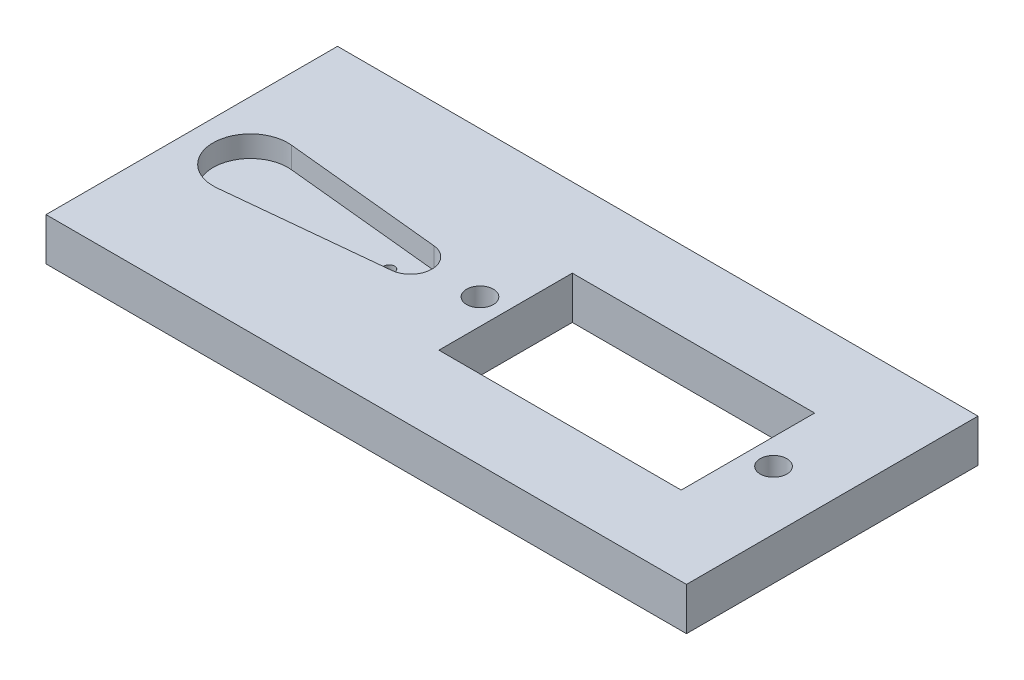
ISO-10303-21;
HEADER;
FILE_DESCRIPTION(('STEP AP214'),'2;1');
FILE_NAME('part.step','',(''),(''),'','','');
FILE_SCHEMA(('AUTOMOTIVE_DESIGN { 1 0 10303 214 1 1 1 1 }'));
ENDSEC;
DATA;
#1=APPLICATION_CONTEXT('core data for automotive mechanical design processes');
#2=APPLICATION_PROTOCOL_DEFINITION('international standard','automotive_design',2000,#1);
#3=PRODUCT_CONTEXT('',#1,'mechanical');
#4=PRODUCT('Part','Part','',(#3));
#5=PRODUCT_RELATED_PRODUCT_CATEGORY('part','',(#4));
#6=PRODUCT_DEFINITION_FORMATION('','',#4);
#7=PRODUCT_DEFINITION_CONTEXT('part definition',#1,'design');
#8=PRODUCT_DEFINITION('design','',#6,#7);
#9=PRODUCT_DEFINITION_SHAPE('','',#8);
#10=(LENGTH_UNIT() NAMED_UNIT(*) SI_UNIT(.MILLI.,.METRE.));
#11=(NAMED_UNIT(*) PLANE_ANGLE_UNIT() SI_UNIT($,.RADIAN.));
#12=(NAMED_UNIT(*) SI_UNIT($,.STERADIAN.) SOLID_ANGLE_UNIT());
#13=UNCERTAINTY_MEASURE_WITH_UNIT(LENGTH_MEASURE(1.E-05),#10,'distance_accuracy_value','');
#14=(GEOMETRIC_REPRESENTATION_CONTEXT(3) GLOBAL_UNCERTAINTY_ASSIGNED_CONTEXT((#13)) GLOBAL_UNIT_ASSIGNED_CONTEXT((#10,
#11,#12)) REPRESENTATION_CONTEXT('',''));
#15=CARTESIAN_POINT('',(0.,0.,0.));
#16=DIRECTION('',(0.,0.,1.));
#17=DIRECTION('',(1.,0.,0.));
#18=AXIS2_PLACEMENT_3D('',#15,#16,#17);
#19=CARTESIAN_POINT('',(0.,4.,-6.25));
#20=DIRECTION('',(0.,0.,-1.));
#21=DIRECTION('',(-1.,0.,0.));
#22=AXIS2_PLACEMENT_3D('',#19,#20,#21);
#23=PLANE('',#22);
#24=DIRECTION('',(1.,0.,0.));
#25=VECTOR('',#24,1.);
#26=CARTESIAN_POINT('',(0.,0.,-6.25));
#27=LINE('',#26,#25);
#28=CARTESIAN_POINT('',(-0.6,0.,-6.25));
#29=VERTEX_POINT('',#28);
#30=CARTESIAN_POINT('',(22.1,0.,-6.25));
#31=VERTEX_POINT('',#30);
#32=EDGE_CURVE('E195',#29,#31,#27,.T.);
#33=ORIENTED_EDGE('',*,*,#32,.T.);
#34=DIRECTION('',(0.,-1.,0.));
#35=VECTOR('',#34,1.);
#36=CARTESIAN_POINT('',(22.1,4.,-6.25));
#37=LINE('',#36,#35);
#38=CARTESIAN_POINT('',(22.1,4.,-6.25));
#39=VERTEX_POINT('',#38);
#40=EDGE_CURVE('E11',#39,#31,#37,.T.);
#41=ORIENTED_EDGE('',*,*,#40,.F.);
#42=DIRECTION('',(1.,0.,0.));
#43=VECTOR('',#42,1.);
#44=CARTESIAN_POINT('',(0.,4.,-6.25));
#45=LINE('',#44,#43);
#46=CARTESIAN_POINT('',(-0.6,4.,-6.25));
#47=VERTEX_POINT('',#46);
#48=EDGE_CURVE('E147',#47,#39,#45,.T.);
#49=ORIENTED_EDGE('',*,*,#48,.F.);
#50=DIRECTION('',(0.,-1.,0.));
#51=VECTOR('',#50,1.);
#52=CARTESIAN_POINT('',(-0.6,4.,-6.25));
#53=LINE('',#52,#51);
#54=EDGE_CURVE('E72',#47,#29,#53,.T.);
#55=ORIENTED_EDGE('',*,*,#54,.T.);
#56=EDGE_LOOP('',(#33,#41,#49,#55));
#57=FACE_BOUND('',#56,.T.);
#58=ADVANCED_FACE('F45',(#57),#23,.F.);
#59=CARTESIAN_POINT('',(22.1,4.,0.));
#60=DIRECTION('',(1.,0.,0.));
#61=DIRECTION('',(0.,0.,-1.));
#62=AXIS2_PLACEMENT_3D('',#59,#60,#61);
#63=PLANE('',#62);
#64=DIRECTION('',(0.,0.,1.));
#65=VECTOR('',#64,1.);
#66=CARTESIAN_POINT('',(22.1,0.,0.));
#67=LINE('',#66,#65);
#68=CARTESIAN_POINT('',(22.1,0.,6.25));
#69=VERTEX_POINT('',#68);
#70=EDGE_CURVE('E154',#31,#69,#67,.T.);
#71=ORIENTED_EDGE('',*,*,#70,.T.);
#72=DIRECTION('',(0.,-1.,0.));
#73=VECTOR('',#72,1.);
#74=CARTESIAN_POINT('',(22.1,4.,6.25));
#75=LINE('',#74,#73);
#76=CARTESIAN_POINT('',(22.1,4.,6.25));
#77=VERTEX_POINT('',#76);
#78=EDGE_CURVE('E55',#77,#69,#75,.T.);
#79=ORIENTED_EDGE('',*,*,#78,.F.);
#80=DIRECTION('',(0.,0.,1.));
#81=VECTOR('',#80,1.);
#82=CARTESIAN_POINT('',(22.1,4.,0.));
#83=LINE('',#82,#81);
#84=EDGE_CURVE('E141',#39,#77,#83,.T.);
#85=ORIENTED_EDGE('',*,*,#84,.F.);
#86=ORIENTED_EDGE('',*,*,#40,.T.);
#87=EDGE_LOOP('',(#71,#79,#85,#86));
#88=FACE_BOUND('',#87,.T.);
#89=ADVANCED_FACE('F153',(#88),#63,.F.);
#90=CARTESIAN_POINT('',(0.,4.,6.25));
#91=DIRECTION('',(0.,0.,-1.));
#92=DIRECTION('',(-1.,0.,0.));
#93=AXIS2_PLACEMENT_3D('',#90,#91,#92);
#94=PLANE('',#93);
#95=DIRECTION('',(1.,0.,0.));
#96=VECTOR('',#95,1.);
#97=CARTESIAN_POINT('',(0.,0.,6.25));
#98=LINE('',#97,#96);
#99=CARTESIAN_POINT('',(-0.599999999999996,0.,6.25));
#100=VERTEX_POINT('',#99);
#101=EDGE_CURVE('E200',#100,#69,#98,.T.);
#102=ORIENTED_EDGE('',*,*,#101,.F.);
#103=DIRECTION('',(0.,-1.,0.));
#104=VECTOR('',#103,1.);
#105=CARTESIAN_POINT('',(-0.599999999999996,4.,6.25));
#106=LINE('',#105,#104);
#107=CARTESIAN_POINT('',(-0.599999999999996,4.,6.25));
#108=VERTEX_POINT('',#107);
#109=EDGE_CURVE('E159',#108,#100,#106,.T.);
#110=ORIENTED_EDGE('',*,*,#109,.F.);
#111=DIRECTION('',(1.,0.,0.));
#112=VECTOR('',#111,1.);
#113=CARTESIAN_POINT('',(0.,4.,6.25));
#114=LINE('',#113,#112);
#115=EDGE_CURVE('E146',#108,#77,#114,.T.);
#116=ORIENTED_EDGE('',*,*,#115,.T.);
#117=ORIENTED_EDGE('',*,*,#78,.T.);
#118=EDGE_LOOP('',(#102,#110,#116,#117));
#119=FACE_BOUND('',#118,.T.);
#120=ADVANCED_FACE('F161',(#119),#94,.T.);
#121=CARTESIAN_POINT('',(30.,4.,0.));
#122=DIRECTION('',(1.,0.,0.));
#123=DIRECTION('',(0.,0.,-1.));
#124=AXIS2_PLACEMENT_3D('',#121,#122,#123);
#125=PLANE('',#124);
#126=DIRECTION('',(0.,0.,1.));
#127=VECTOR('',#126,1.);
#128=CARTESIAN_POINT('',(30.,0.,0.));
#129=LINE('',#128,#127);
#130=CARTESIAN_POINT('',(30.,0.,-13.6546112857514));
#131=VERTEX_POINT('',#130);
#132=CARTESIAN_POINT('',(30.,0.,13.6546112857514));
#133=VERTEX_POINT('',#132);
#134=EDGE_CURVE('E179',#131,#133,#129,.T.);
#135=ORIENTED_EDGE('',*,*,#134,.F.);
#136=DIRECTION('',(0.,-1.,0.));
#137=VECTOR('',#136,1.);
#138=CARTESIAN_POINT('',(30.,4.,-13.6546112857514));
#139=LINE('',#138,#137);
#140=CARTESIAN_POINT('',(30.,4.,-13.6546112857514));
#141=VERTEX_POINT('',#140);
#142=EDGE_CURVE('E210',#141,#131,#139,.T.);
#143=ORIENTED_EDGE('',*,*,#142,.F.);
#144=DIRECTION('',(0.,0.,1.));
#145=VECTOR('',#144,1.);
#146=CARTESIAN_POINT('',(30.,4.,0.));
#147=LINE('',#146,#145);
#148=CARTESIAN_POINT('',(30.,4.,13.6546112857514));
#149=VERTEX_POINT('',#148);
#150=EDGE_CURVE('E286',#141,#149,#147,.T.);
#151=ORIENTED_EDGE('',*,*,#150,.T.);
#152=DIRECTION('',(0.,-1.,0.));
#153=VECTOR('',#152,1.);
#154=CARTESIAN_POINT('',(30.,4.,13.6546112857514));
#155=LINE('',#154,#153);
#156=EDGE_CURVE('E213',#149,#133,#155,.T.);
#157=ORIENTED_EDGE('',*,*,#156,.T.);
#158=EDGE_LOOP('',(#135,#143,#151,#157));
#159=FACE_BOUND('',#158,.T.);
#160=ADVANCED_FACE('F311',(#159),#125,.T.);
#161=CARTESIAN_POINT('',(0.,4.,-13.6546112857514));
#162=DIRECTION('',(0.,0.,-1.));
#163=DIRECTION('',(-1.,0.,0.));
#164=AXIS2_PLACEMENT_3D('',#161,#162,#163);
#165=PLANE('',#164);
#166=DIRECTION('',(1.,0.,0.));
#167=VECTOR('',#166,1.);
#168=CARTESIAN_POINT('',(0.,0.,-13.6546112857514));
#169=LINE('',#168,#167);
#170=CARTESIAN_POINT('',(-30.,0.,-13.6546112857514));
#171=VERTEX_POINT('',#170);
#172=EDGE_CURVE('E183',#171,#131,#169,.T.);
#173=ORIENTED_EDGE('',*,*,#172,.F.);
#174=DIRECTION('',(0.,-1.,0.));
#175=VECTOR('',#174,1.);
#176=CARTESIAN_POINT('',(-30.,4.,-13.6546112857514));
#177=LINE('',#176,#175);
#178=CARTESIAN_POINT('',(-30.,4.,-13.6546112857514));
#179=VERTEX_POINT('',#178);
#180=EDGE_CURVE('E220',#179,#171,#177,.T.);
#181=ORIENTED_EDGE('',*,*,#180,.F.);
#182=DIRECTION('',(1.,0.,0.));
#183=VECTOR('',#182,1.);
#184=CARTESIAN_POINT('',(0.,4.,-13.6546112857514));
#185=LINE('',#184,#183);
#186=EDGE_CURVE('E290',#179,#141,#185,.T.);
#187=ORIENTED_EDGE('',*,*,#186,.T.);
#188=ORIENTED_EDGE('',*,*,#142,.T.);
#189=EDGE_LOOP('',(#173,#181,#187,#188));
#190=FACE_BOUND('',#189,.T.);
#191=ADVANCED_FACE('F314',(#190),#165,.T.);
#192=CARTESIAN_POINT('',(-30.,4.,0.));
#193=DIRECTION('',(1.,0.,0.));
#194=DIRECTION('',(0.,0.,-1.));
#195=AXIS2_PLACEMENT_3D('',#192,#193,#194);
#196=PLANE('',#195);
#197=DIRECTION('',(0.,0.,1.));
#198=VECTOR('',#197,1.);
#199=CARTESIAN_POINT('',(-30.,0.,0.));
#200=LINE('',#199,#198);
#201=CARTESIAN_POINT('',(-30.,0.,13.6546112857514));
#202=VERTEX_POINT('',#201);
#203=EDGE_CURVE('E187',#171,#202,#200,.T.);
#204=ORIENTED_EDGE('',*,*,#203,.T.);
#205=DIRECTION('',(0.,-1.,0.));
#206=VECTOR('',#205,1.);
#207=CARTESIAN_POINT('',(-30.,4.,13.6546112857514));
#208=LINE('',#207,#206);
#209=CARTESIAN_POINT('',(-30.,4.,13.6546112857514));
#210=VERTEX_POINT('',#209);
#211=EDGE_CURVE('E216',#210,#202,#208,.T.);
#212=ORIENTED_EDGE('',*,*,#211,.F.);
#213=DIRECTION('',(0.,0.,1.));
#214=VECTOR('',#213,1.);
#215=CARTESIAN_POINT('',(-30.,4.,0.));
#216=LINE('',#215,#214);
#217=EDGE_CURVE('E294',#179,#210,#216,.T.);
#218=ORIENTED_EDGE('',*,*,#217,.F.);
#219=ORIENTED_EDGE('',*,*,#180,.T.);
#220=EDGE_LOOP('',(#204,#212,#218,#219));
#221=FACE_BOUND('',#220,.T.);
#222=ADVANCED_FACE('F317',(#221),#196,.F.);
#223=CARTESIAN_POINT('',(-9.5,4.,0.));
#224=DIRECTION('',(0.,-1.,0.));
#225=DIRECTION('',(0.,0.,-1.));
#226=AXIS2_PLACEMENT_3D('',#223,#224,#225);
#227=CYLINDRICAL_SURFACE('',#226,2.);
#228=CARTESIAN_POINT('',(-9.5,2.,0.));
#229=DIRECTION('',(0.,1.,0.));
#230=DIRECTION('',(0.,0.,1.));
#231=AXIS2_PLACEMENT_3D('',#228,#229,#230);
#232=CIRCLE('',#231,2.);
#233=CARTESIAN_POINT('',(-9.3,2.,1.98997487421324));
#234=VERTEX_POINT('',#233);
#235=CARTESIAN_POINT('',(-9.3,2.,-1.98997487421324));
#236=VERTEX_POINT('',#235);
#237=EDGE_CURVE('E63',#234,#236,#232,.T.);
#238=ORIENTED_EDGE('',*,*,#237,.F.);
#239=DIRECTION('',(0.,-1.,0.));
#240=VECTOR('',#239,1.);
#241=CARTESIAN_POINT('',(-9.3,4.,1.98997487421324));
#242=LINE('',#241,#240);
#243=CARTESIAN_POINT('',(-9.3,4.,1.98997487421324));
#244=VERTEX_POINT('',#243);
#245=EDGE_CURVE('E49',#244,#234,#242,.T.);
#246=ORIENTED_EDGE('',*,*,#245,.F.);
#247=CARTESIAN_POINT('',(-9.5,4.,0.));
#248=DIRECTION('',(0.,1.,0.));
#249=DIRECTION('',(0.,0.,1.));
#250=AXIS2_PLACEMENT_3D('',#247,#248,#249);
#251=CIRCLE('',#250,2.);
#252=CARTESIAN_POINT('',(-9.3,4.,-1.98997487421324));
#253=VERTEX_POINT('',#252);
#254=EDGE_CURVE('E275',#244,#253,#251,.T.);
#255=ORIENTED_EDGE('',*,*,#254,.T.);
#256=DIRECTION('',(0.,-1.,0.));
#257=VECTOR('',#256,1.);
#258=CARTESIAN_POINT('',(-9.3,4.,-1.98997487421324));
#259=LINE('',#258,#257);
#260=EDGE_CURVE('E166',#253,#236,#259,.T.);
#261=ORIENTED_EDGE('',*,*,#260,.T.);
#262=EDGE_LOOP('',(#238,#246,#255,#261));
#263=FACE_BOUND('',#262,.T.);
#264=ADVANCED_FACE('F351',(#263),#227,.F.);
#265=CARTESIAN_POINT('',(0.105,4.,1.04473680896195));
#266=DIRECTION('',(-0.1,0.,-0.99498743710662));
#267=DIRECTION('',(-0.99498743710662,0.,0.1));
#268=AXIS2_PLACEMENT_3D('',#265,#266,#267);
#269=PLANE('',#268);
#270=DIRECTION('',(0.99498743710662,0.,-0.1));
#271=VECTOR('',#270,1.);
#272=CARTESIAN_POINT('',(0.105,2.,1.04473680896195));
#273=LINE('',#272,#271);
#274=CARTESIAN_POINT('',(-24.15,2.,3.48245602987317));
#275=VERTEX_POINT('',#274);
#276=EDGE_CURVE('E244',#275,#234,#273,.T.);
#277=ORIENTED_EDGE('',*,*,#276,.F.);
#278=DIRECTION('',(0.,-1.,0.));
#279=VECTOR('',#278,1.);
#280=CARTESIAN_POINT('',(-24.15,4.,3.48245602987317));
#281=LINE('',#280,#279);
#282=CARTESIAN_POINT('',(-24.15,4.,3.48245602987317));
#283=VERTEX_POINT('',#282);
#284=EDGE_CURVE('E231',#283,#275,#281,.T.);
#285=ORIENTED_EDGE('',*,*,#284,.F.);
#286=DIRECTION('',(0.99498743710662,0.,-0.1));
#287=VECTOR('',#286,1.);
#288=CARTESIAN_POINT('',(0.105,4.,1.04473680896195));
#289=LINE('',#288,#287);
#290=EDGE_CURVE('E246',#283,#244,#289,.T.);
#291=ORIENTED_EDGE('',*,*,#290,.T.);
#292=ORIENTED_EDGE('',*,*,#245,.T.);
#293=EDGE_LOOP('',(#277,#285,#291,#292));
#294=FACE_BOUND('',#293,.T.);
#295=ADVANCED_FACE('F243',(#294),#269,.T.);
#296=CARTESIAN_POINT('',(-24.5,4.,0.));
#297=DIRECTION('',(0.,-1.,0.));
#298=DIRECTION('',(0.,0.,-1.));
#299=AXIS2_PLACEMENT_3D('',#296,#297,#298);
#300=CYLINDRICAL_SURFACE('',#299,3.5);
#301=CARTESIAN_POINT('',(-24.5,2.,0.));
#302=DIRECTION('',(0.,1.,0.));
#303=DIRECTION('',(0.,0.,1.));
#304=AXIS2_PLACEMENT_3D('',#301,#302,#303);
#305=CIRCLE('',#304,3.5);
#306=CARTESIAN_POINT('',(-24.15,2.,-3.48245602987317));
#307=VERTEX_POINT('',#306);
#308=EDGE_CURVE('E249',#307,#275,#305,.T.);
#309=ORIENTED_EDGE('',*,*,#308,.F.);
#310=DIRECTION('',(0.,-1.,0.));
#311=VECTOR('',#310,1.);
#312=CARTESIAN_POINT('',(-24.15,4.,-3.48245602987317));
#313=LINE('',#312,#311);
#314=CARTESIAN_POINT('',(-24.15,4.,-3.48245602987317));
#315=VERTEX_POINT('',#314);
#316=EDGE_CURVE('E228',#315,#307,#313,.T.);
#317=ORIENTED_EDGE('',*,*,#316,.F.);
#318=CARTESIAN_POINT('',(-24.5,4.,0.));
#319=DIRECTION('',(0.,1.,0.));
#320=DIRECTION('',(0.,0.,1.));
#321=AXIS2_PLACEMENT_3D('',#318,#319,#320);
#322=CIRCLE('',#321,3.5);
#323=EDGE_CURVE('E280',#315,#283,#322,.T.);
#324=ORIENTED_EDGE('',*,*,#323,.T.);
#325=ORIENTED_EDGE('',*,*,#284,.T.);
#326=EDGE_LOOP('',(#309,#317,#324,#325));
#327=FACE_BOUND('',#326,.T.);
#328=ADVANCED_FACE('F348',(#327),#300,.F.);
#329=CARTESIAN_POINT('',(0.,4.,13.6546112857514));
#330=DIRECTION('',(0.,0.,-1.));
#331=DIRECTION('',(-1.,0.,0.));
#332=AXIS2_PLACEMENT_3D('',#329,#330,#331);
#333=PLANE('',#332);
#334=DIRECTION('',(1.,0.,0.));
#335=VECTOR('',#334,1.);
#336=CARTESIAN_POINT('',(0.,0.,13.6546112857514));
#337=LINE('',#336,#335);
#338=EDGE_CURVE('E191',#202,#133,#337,.T.);
#339=ORIENTED_EDGE('',*,*,#338,.T.);
#340=ORIENTED_EDGE('',*,*,#156,.F.);
#341=DIRECTION('',(1.,0.,0.));
#342=VECTOR('',#341,1.);
#343=CARTESIAN_POINT('',(0.,4.,13.6546112857514));
#344=LINE('',#343,#342);
#345=EDGE_CURVE('E298',#210,#149,#344,.T.);
#346=ORIENTED_EDGE('',*,*,#345,.F.);
#347=ORIENTED_EDGE('',*,*,#211,.T.);
#348=EDGE_LOOP('',(#339,#340,#346,#347));
#349=FACE_BOUND('',#348,.T.);
#350=ADVANCED_FACE('F308',(#349),#333,.F.);
#351=CARTESIAN_POINT('',(0.105,4.,-1.04473680896195));
#352=DIRECTION('',(0.1,0.,-0.99498743710662));
#353=DIRECTION('',(-0.99498743710662,0.,-0.1));
#354=AXIS2_PLACEMENT_3D('',#351,#352,#353);
#355=PLANE('',#354);
#356=ORIENTED_EDGE('',*,*,#316,.T.);
#357=DIRECTION('',(0.99498743710662,0.,0.1));
#358=VECTOR('',#357,1.);
#359=CARTESIAN_POINT('',(0.105,2.,-1.04473680896195));
#360=LINE('',#359,#358);
#361=EDGE_CURVE('E175',#307,#236,#360,.T.);
#362=ORIENTED_EDGE('',*,*,#361,.T.);
#363=ORIENTED_EDGE('',*,*,#260,.F.);
#364=DIRECTION('',(0.99498743710662,0.,0.1));
#365=VECTOR('',#364,1.);
#366=CARTESIAN_POINT('',(0.105,4.,-1.04473680896195));
#367=LINE('',#366,#365);
#368=EDGE_CURVE('E283',#315,#253,#367,.T.);
#369=ORIENTED_EDGE('',*,*,#368,.F.);
#370=EDGE_LOOP('',(#356,#362,#363,#369));
#371=FACE_BOUND('',#370,.T.);
#372=ADVANCED_FACE('F347',(#371),#355,.F.);
#373=CARTESIAN_POINT('',(-3.,4.,0.));
#374=DIRECTION('',(0.,-1.,0.));
#375=DIRECTION('',(0.,0.,-1.));
#376=AXIS2_PLACEMENT_3D('',#373,#374,#375);
#377=CYLINDRICAL_SURFACE('',#376,1.25);
#378=CARTESIAN_POINT('',(-3.,4.,0.));
#379=DIRECTION('',(0.,1.,0.));
#380=DIRECTION('',(0.,0.,1.));
#381=AXIS2_PLACEMENT_3D('',#378,#379,#380);
#382=CIRCLE('',#381,1.25);
#383=CARTESIAN_POINT('',(-3.,4.,1.25));
#384=VERTEX_POINT('',#383);
#385=EDGE_CURVE('E271',#384,#384,#382,.T.);
#386=ORIENTED_EDGE('',*,*,#385,.T.);
#387=EDGE_LOOP('',(#386));
#388=FACE_BOUND('',#387,.T.);
#389=CARTESIAN_POINT('',(-3.,0.,0.));
#390=DIRECTION('',(0.,1.,0.));
#391=DIRECTION('',(0.,0.,1.));
#392=AXIS2_PLACEMENT_3D('',#389,#390,#391);
#393=CIRCLE('',#392,1.25);
#394=CARTESIAN_POINT('',(-3.,0.,1.25));
#395=VERTEX_POINT('',#394);
#396=EDGE_CURVE('E174',#395,#395,#393,.T.);
#397=ORIENTED_EDGE('',*,*,#396,.F.);
#398=EDGE_LOOP('',(#397));
#399=FACE_BOUND('',#398,.T.);
#400=ADVANCED_FACE('F358',(#388,#399),#377,.F.);
#401=CARTESIAN_POINT('',(24.5,4.,0.));
#402=DIRECTION('',(0.,-1.,0.));
#403=DIRECTION('',(0.,0.,-1.));
#404=AXIS2_PLACEMENT_3D('',#401,#402,#403);
#405=CYLINDRICAL_SURFACE('',#404,1.25);
#406=CARTESIAN_POINT('',(24.5,4.,0.));
#407=DIRECTION('',(0.,1.,0.));
#408=DIRECTION('',(0.,0.,1.));
#409=AXIS2_PLACEMENT_3D('',#406,#407,#408);
#410=CIRCLE('',#409,1.25);
#411=CARTESIAN_POINT('',(24.5,4.,1.25));
#412=VERTEX_POINT('',#411);
#413=EDGE_CURVE('E207',#412,#412,#410,.T.);
#414=ORIENTED_EDGE('',*,*,#413,.T.);
#415=EDGE_LOOP('',(#414));
#416=FACE_BOUND('',#415,.T.);
#417=CARTESIAN_POINT('',(24.5,0.,0.));
#418=DIRECTION('',(0.,1.,0.));
#419=DIRECTION('',(0.,0.,1.));
#420=AXIS2_PLACEMENT_3D('',#417,#418,#419);
#421=CIRCLE('',#420,1.25);
#422=CARTESIAN_POINT('',(24.5,0.,1.25));
#423=VERTEX_POINT('',#422);
#424=EDGE_CURVE('E170',#423,#423,#421,.T.);
#425=ORIENTED_EDGE('',*,*,#424,.F.);
#426=EDGE_LOOP('',(#425));
#427=FACE_BOUND('',#426,.T.);
#428=ADVANCED_FACE('F47',(#416,#427),#405,.F.);
#429=CARTESIAN_POINT('',(-0.599999999999998,4.,0.));
#430=DIRECTION('',(1.,0.,0.));
#431=DIRECTION('',(0.,0.,-1.));
#432=AXIS2_PLACEMENT_3D('',#429,#430,#431);
#433=PLANE('',#432);
#434=DIRECTION('',(0.,0.,1.));
#435=VECTOR('',#434,1.);
#436=CARTESIAN_POINT('',(-0.599999999999998,0.,0.));
#437=LINE('',#436,#435);
#438=EDGE_CURVE('E203',#29,#100,#437,.T.);
#439=ORIENTED_EDGE('',*,*,#438,.F.);
#440=ORIENTED_EDGE('',*,*,#54,.F.);
#441=DIRECTION('',(0.,0.,1.));
#442=VECTOR('',#441,1.);
#443=CARTESIAN_POINT('',(-0.599999999999998,4.,0.));
#444=LINE('',#443,#442);
#445=EDGE_CURVE('E163',#47,#108,#444,.T.);
#446=ORIENTED_EDGE('',*,*,#445,.T.);
#447=ORIENTED_EDGE('',*,*,#109,.T.);
#448=EDGE_LOOP('',(#439,#440,#446,#447));
#449=FACE_BOUND('',#448,.T.);
#450=ADVANCED_FACE('F370',(#449),#433,.T.);
#451=CARTESIAN_POINT('',(0.,4.,0.));
#452=DIRECTION('',(0.,1.,0.));
#453=DIRECTION('',(0.,0.,1.));
#454=AXIS2_PLACEMENT_3D('',#451,#452,#453);
#455=PLANE('',#454);
#456=ORIENTED_EDGE('',*,*,#413,.F.);
#457=EDGE_LOOP('',(#456));
#458=FACE_BOUND('',#457,.T.);
#459=ORIENTED_EDGE('',*,*,#385,.F.);
#460=EDGE_LOOP('',(#459));
#461=FACE_BOUND('',#460,.T.);
#462=ORIENTED_EDGE('',*,*,#254,.F.);
#463=ORIENTED_EDGE('',*,*,#290,.F.);
#464=ORIENTED_EDGE('',*,*,#323,.F.);
#465=ORIENTED_EDGE('',*,*,#368,.T.);
#466=EDGE_LOOP('',(#462,#463,#464,#465));
#467=FACE_BOUND('',#466,.T.);
#468=ORIENTED_EDGE('',*,*,#150,.F.);
#469=ORIENTED_EDGE('',*,*,#186,.F.);
#470=ORIENTED_EDGE('',*,*,#217,.T.);
#471=ORIENTED_EDGE('',*,*,#345,.T.);
#472=EDGE_LOOP('',(#468,#469,#470,#471));
#473=FACE_BOUND('',#472,.T.);
#474=ORIENTED_EDGE('',*,*,#48,.T.);
#475=ORIENTED_EDGE('',*,*,#84,.T.);
#476=ORIENTED_EDGE('',*,*,#115,.F.);
#477=ORIENTED_EDGE('',*,*,#445,.F.);
#478=EDGE_LOOP('',(#474,#475,#476,#477));
#479=FACE_BOUND('',#478,.T.);
#480=ADVANCED_FACE('F143',(#458,#461,#467,#473,#479),#455,.T.);
#481=CARTESIAN_POINT('',(0.,0.,0.));
#482=DIRECTION('',(0.,1.,0.));
#483=DIRECTION('',(0.,0.,1.));
#484=AXIS2_PLACEMENT_3D('',#481,#482,#483);
#485=PLANE('',#484);
#486=ORIENTED_EDGE('',*,*,#424,.T.);
#487=EDGE_LOOP('',(#486));
#488=FACE_BOUND('',#487,.T.);
#489=ORIENTED_EDGE('',*,*,#396,.T.);
#490=EDGE_LOOP('',(#489));
#491=FACE_BOUND('',#490,.T.);
#492=ORIENTED_EDGE('',*,*,#134,.T.);
#493=ORIENTED_EDGE('',*,*,#338,.F.);
#494=ORIENTED_EDGE('',*,*,#203,.F.);
#495=ORIENTED_EDGE('',*,*,#172,.T.);
#496=EDGE_LOOP('',(#492,#493,#494,#495));
#497=FACE_BOUND('',#496,.T.);
#498=ORIENTED_EDGE('',*,*,#32,.F.);
#499=ORIENTED_EDGE('',*,*,#438,.T.);
#500=ORIENTED_EDGE('',*,*,#101,.T.);
#501=ORIENTED_EDGE('',*,*,#70,.F.);
#502=EDGE_LOOP('',(#498,#499,#500,#501));
#503=FACE_BOUND('',#502,.T.);
#504=CARTESIAN_POINT('',(-11.5,0.,0.));
#505=DIRECTION('',(0.,1.,0.));
#506=DIRECTION('',(0.,0.,1.));
#507=AXIS2_PLACEMENT_3D('',#504,#505,#506);
#508=CIRCLE('',#507,0.499999999999999);
#509=CARTESIAN_POINT('',(-11.5,0.,0.499999999999999));
#510=VERTEX_POINT('',#509);
#511=EDGE_CURVE('E258',#510,#510,#508,.T.);
#512=ORIENTED_EDGE('',*,*,#511,.T.);
#513=EDGE_LOOP('',(#512));
#514=FACE_BOUND('',#513,.T.);
#515=ADVANCED_FACE('F319',(#488,#491,#497,#503,#514),#485,.F.);
#516=CARTESIAN_POINT('',(-11.5,2.,0.));
#517=DIRECTION('',(0.,-1.,0.));
#518=DIRECTION('',(0.,0.,-1.));
#519=AXIS2_PLACEMENT_3D('',#516,#517,#518);
#520=CYLINDRICAL_SURFACE('',#519,0.499999999999999);
#521=CARTESIAN_POINT('',(-11.5,2.,0.));
#522=DIRECTION('',(0.,1.,0.));
#523=DIRECTION('',(0.,0.,1.));
#524=AXIS2_PLACEMENT_3D('',#521,#522,#523);
#525=CIRCLE('',#524,0.499999999999999);
#526=CARTESIAN_POINT('',(-11.5,2.,0.499999999999999));
#527=VERTEX_POINT('',#526);
#528=EDGE_CURVE('E252',#527,#527,#525,.T.);
#529=ORIENTED_EDGE('',*,*,#528,.T.);
#530=EDGE_LOOP('',(#529));
#531=FACE_BOUND('',#530,.T.);
#532=ORIENTED_EDGE('',*,*,#511,.F.);
#533=EDGE_LOOP('',(#532));
#534=FACE_BOUND('',#533,.T.);
#535=ADVANCED_FACE('F322',(#531,#534),#520,.F.);
#536=CARTESIAN_POINT('',(0.,2.,0.));
#537=DIRECTION('',(0.,1.,0.));
#538=DIRECTION('',(0.,0.,1.));
#539=AXIS2_PLACEMENT_3D('',#536,#537,#538);
#540=PLANE('',#539);
#541=ORIENTED_EDGE('',*,*,#528,.F.);
#542=EDGE_LOOP('',(#541));
#543=FACE_BOUND('',#542,.T.);
#544=ORIENTED_EDGE('',*,*,#308,.T.);
#545=ORIENTED_EDGE('',*,*,#276,.T.);
#546=ORIENTED_EDGE('',*,*,#237,.T.);
#547=ORIENTED_EDGE('',*,*,#361,.F.);
#548=EDGE_LOOP('',(#544,#545,#546,#547));
#549=FACE_BOUND('',#548,.T.);
#550=ADVANCED_FACE('F250',(#543,#549),#540,.T.);
#551=CLOSED_SHELL('',(#58,#89,#120,#160,#191,#222,#264,#295,#328,#350,#372,#400,#428,#450,#480,
#515,#535,#550));
#552=MANIFOLD_SOLID_BREP('B2',#551);
#553=ADVANCED_BREP_SHAPE_REPRESENTATION('',(#18,#552),#14);
#554=SHAPE_DEFINITION_REPRESENTATION(#9,#553);
ENDSEC;
END-ISO-10303-21;
